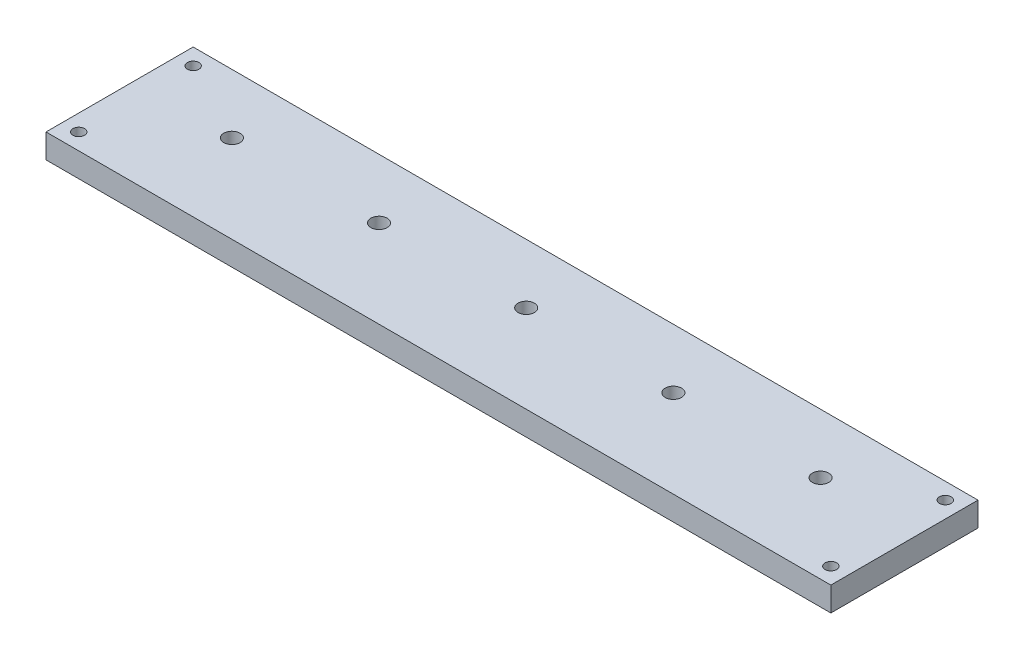
ISO-10303-21;
HEADER;
FILE_DESCRIPTION(('STEP AP214'),'2;1');
FILE_NAME('part.step','',(''),(''),'','','');
FILE_SCHEMA(('AUTOMOTIVE_DESIGN { 1 0 10303 214 1 1 1 1 }'));
ENDSEC;
DATA;
#1=APPLICATION_CONTEXT('core data for automotive mechanical design processes');
#2=APPLICATION_PROTOCOL_DEFINITION('international standard','automotive_design',2000,#1);
#3=PRODUCT_CONTEXT('',#1,'mechanical');
#4=PRODUCT('Part','Part','',(#3));
#5=PRODUCT_RELATED_PRODUCT_CATEGORY('part','',(#4));
#6=PRODUCT_DEFINITION_FORMATION('','',#4);
#7=PRODUCT_DEFINITION_CONTEXT('part definition',#1,'design');
#8=PRODUCT_DEFINITION('design','',#6,#7);
#9=PRODUCT_DEFINITION_SHAPE('','',#8);
#10=(LENGTH_UNIT() NAMED_UNIT(*) SI_UNIT(.MILLI.,.METRE.));
#11=(NAMED_UNIT(*) PLANE_ANGLE_UNIT() SI_UNIT($,.RADIAN.));
#12=(NAMED_UNIT(*) SI_UNIT($,.STERADIAN.) SOLID_ANGLE_UNIT());
#13=UNCERTAINTY_MEASURE_WITH_UNIT(LENGTH_MEASURE(1.E-05),#10,'distance_accuracy_value','');
#14=(GEOMETRIC_REPRESENTATION_CONTEXT(3) GLOBAL_UNCERTAINTY_ASSIGNED_CONTEXT((#13)) GLOBAL_UNIT_ASSIGNED_CONTEXT((#10,
#11,#12)) REPRESENTATION_CONTEXT('',''));
#15=CARTESIAN_POINT('',(0.,0.,0.));
#16=DIRECTION('',(0.,0.,1.));
#17=DIRECTION('',(1.,0.,0.));
#18=AXIS2_PLACEMENT_3D('',#15,#16,#17);
#19=CARTESIAN_POINT('',(19.05,4.699,-17.0434));
#20=DIRECTION('',(0.,-1.,0.));
#21=DIRECTION('',(0.,0.,-1.));
#22=AXIS2_PLACEMENT_3D('',#19,#20,#21);
#23=CYLINDRICAL_SURFACE('',#22,1.5875);
#24=CARTESIAN_POINT('',(19.05,4.699,-17.0434));
#25=DIRECTION('',(0.,1.,0.));
#26=DIRECTION('',(0.,0.,1.));
#27=AXIS2_PLACEMENT_3D('',#24,#25,#26);
#28=CIRCLE('',#27,1.5875);
#29=CARTESIAN_POINT('',(19.05,4.699,-15.4559));
#30=VERTEX_POINT('',#29);
#31=EDGE_CURVE('E216',#30,#30,#28,.T.);
#32=ORIENTED_EDGE('',*,*,#31,.T.);
#33=EDGE_LOOP('',(#32));
#34=FACE_BOUND('',#33,.T.);
#35=CARTESIAN_POINT('',(19.05,1.778,-17.0434));
#36=DIRECTION('',(0.,-1.,0.));
#37=DIRECTION('',(0.,0.,-1.));
#38=AXIS2_PLACEMENT_3D('',#35,#36,#37);
#39=CIRCLE('',#38,1.5875);
#40=CARTESIAN_POINT('',(19.05,1.778,-18.6309));
#41=VERTEX_POINT('',#40);
#42=EDGE_CURVE('E49',#41,#41,#39,.T.);
#43=ORIENTED_EDGE('',*,*,#42,.T.);
#44=EDGE_LOOP('',(#43));
#45=FACE_BOUND('',#44,.T.);
#46=ADVANCED_FACE('F45',(#34,#45),#23,.F.);
#47=CARTESIAN_POINT('',(47.625,4.699,-17.0434));
#48=DIRECTION('',(0.,-1.,0.));
#49=DIRECTION('',(0.,0.,-1.));
#50=AXIS2_PLACEMENT_3D('',#47,#48,#49);
#51=CYLINDRICAL_SURFACE('',#50,1.5875);
#52=CARTESIAN_POINT('',(47.625,4.699,-17.0434));
#53=DIRECTION('',(0.,1.,0.));
#54=DIRECTION('',(0.,0.,1.));
#55=AXIS2_PLACEMENT_3D('',#52,#53,#54);
#56=CIRCLE('',#55,1.5875);
#57=CARTESIAN_POINT('',(47.625,4.699,-15.4559));
#58=VERTEX_POINT('',#57);
#59=EDGE_CURVE('E213',#58,#58,#56,.T.);
#60=ORIENTED_EDGE('',*,*,#59,.T.);
#61=EDGE_LOOP('',(#60));
#62=FACE_BOUND('',#61,.T.);
#63=CARTESIAN_POINT('',(47.625,1.778,-17.0434));
#64=DIRECTION('',(0.,-1.,0.));
#65=DIRECTION('',(0.,0.,-1.));
#66=AXIS2_PLACEMENT_3D('',#63,#64,#65);
#67=CIRCLE('',#66,1.5875);
#68=CARTESIAN_POINT('',(47.625,1.778,-18.6309));
#69=VERTEX_POINT('',#68);
#70=EDGE_CURVE('E195',#69,#69,#67,.T.);
#71=ORIENTED_EDGE('',*,*,#70,.T.);
#72=EDGE_LOOP('',(#71));
#73=FACE_BOUND('',#72,.T.);
#74=ADVANCED_FACE('F254',(#62,#73),#51,.F.);
#75=CARTESIAN_POINT('',(76.2,4.699,-17.0434));
#76=DIRECTION('',(0.,-1.,0.));
#77=DIRECTION('',(0.,0.,-1.));
#78=AXIS2_PLACEMENT_3D('',#75,#76,#77);
#79=CYLINDRICAL_SURFACE('',#78,1.5875);
#80=CARTESIAN_POINT('',(76.2,4.699,-17.0434));
#81=DIRECTION('',(0.,1.,0.));
#82=DIRECTION('',(0.,0.,1.));
#83=AXIS2_PLACEMENT_3D('',#80,#81,#82);
#84=CIRCLE('',#83,1.5875);
#85=CARTESIAN_POINT('',(76.2,4.699,-15.4559));
#86=VERTEX_POINT('',#85);
#87=EDGE_CURVE('E210',#86,#86,#84,.T.);
#88=ORIENTED_EDGE('',*,*,#87,.T.);
#89=EDGE_LOOP('',(#88));
#90=FACE_BOUND('',#89,.T.);
#91=CARTESIAN_POINT('',(76.2,1.778,-17.0434));
#92=DIRECTION('',(0.,-1.,0.));
#93=DIRECTION('',(0.,0.,-1.));
#94=AXIS2_PLACEMENT_3D('',#91,#92,#93);
#95=CIRCLE('',#94,1.5875);
#96=CARTESIAN_POINT('',(76.2,1.778,-18.6309));
#97=VERTEX_POINT('',#96);
#98=EDGE_CURVE('E191',#97,#97,#95,.T.);
#99=ORIENTED_EDGE('',*,*,#98,.T.);
#100=EDGE_LOOP('',(#99));
#101=FACE_BOUND('',#100,.T.);
#102=ADVANCED_FACE('F352',(#90,#101),#79,.F.);
#103=CARTESIAN_POINT('',(104.775,4.699,-17.0434));
#104=DIRECTION('',(0.,-1.,0.));
#105=DIRECTION('',(0.,0.,-1.));
#106=AXIS2_PLACEMENT_3D('',#103,#104,#105);
#107=CYLINDRICAL_SURFACE('',#106,1.5875);
#108=CARTESIAN_POINT('',(104.775,4.699,-17.0434));
#109=DIRECTION('',(0.,1.,0.));
#110=DIRECTION('',(0.,0.,1.));
#111=AXIS2_PLACEMENT_3D('',#108,#109,#110);
#112=CIRCLE('',#111,1.5875);
#113=CARTESIAN_POINT('',(104.775,4.699,-15.4559));
#114=VERTEX_POINT('',#113);
#115=EDGE_CURVE('E206',#114,#114,#112,.T.);
#116=ORIENTED_EDGE('',*,*,#115,.T.);
#117=EDGE_LOOP('',(#116));
#118=FACE_BOUND('',#117,.T.);
#119=CARTESIAN_POINT('',(104.775,1.778,-17.0434));
#120=DIRECTION('',(0.,-1.,0.));
#121=DIRECTION('',(0.,0.,-1.));
#122=AXIS2_PLACEMENT_3D('',#119,#120,#121);
#123=CIRCLE('',#122,1.5875);
#124=CARTESIAN_POINT('',(104.775,1.778,-18.6309));
#125=VERTEX_POINT('',#124);
#126=EDGE_CURVE('E155',#125,#125,#123,.T.);
#127=ORIENTED_EDGE('',*,*,#126,.T.);
#128=EDGE_LOOP('',(#127));
#129=FACE_BOUND('',#128,.T.);
#130=ADVANCED_FACE('F361',(#118,#129),#107,.F.);
#131=CARTESIAN_POINT('',(133.35,4.699,-17.0434));
#132=DIRECTION('',(0.,-1.,0.));
#133=DIRECTION('',(0.,0.,-1.));
#134=AXIS2_PLACEMENT_3D('',#131,#132,#133);
#135=CYLINDRICAL_SURFACE('',#134,1.58749999999999);
#136=CARTESIAN_POINT('',(133.35,4.699,-17.0434));
#137=DIRECTION('',(0.,1.,0.));
#138=DIRECTION('',(0.,0.,1.));
#139=AXIS2_PLACEMENT_3D('',#136,#137,#138);
#140=CIRCLE('',#139,1.58749999999999);
#141=CARTESIAN_POINT('',(133.35,4.699,-15.4559));
#142=VERTEX_POINT('',#141);
#143=EDGE_CURVE('E203',#142,#142,#140,.T.);
#144=ORIENTED_EDGE('',*,*,#143,.T.);
#145=EDGE_LOOP('',(#144));
#146=FACE_BOUND('',#145,.T.);
#147=CARTESIAN_POINT('',(133.35,1.778,-17.0434));
#148=DIRECTION('',(0.,-1.,0.));
#149=DIRECTION('',(0.,0.,-1.));
#150=AXIS2_PLACEMENT_3D('',#147,#148,#149);
#151=CIRCLE('',#150,1.58749999999999);
#152=CARTESIAN_POINT('',(133.35,1.778,-18.6309));
#153=VERTEX_POINT('',#152);
#154=EDGE_CURVE('E156',#153,#153,#151,.T.);
#155=ORIENTED_EDGE('',*,*,#154,.T.);
#156=EDGE_LOOP('',(#155));
#157=FACE_BOUND('',#156,.T.);
#158=ADVANCED_FACE('F47',(#146,#157),#135,.F.);
#159=CARTESIAN_POINT('',(0.,4.699,0.));
#160=DIRECTION('',(0.,0.,-1.));
#161=DIRECTION('',(-1.,0.,0.));
#162=AXIS2_PLACEMENT_3D('',#159,#160,#161);
#163=PLANE('',#162);
#164=DIRECTION('',(1.,0.,0.));
#165=VECTOR('',#164,1.);
#166=CARTESIAN_POINT('',(0.,0.,0.));
#167=LINE('',#166,#165);
#168=CARTESIAN_POINT('',(0.,0.,0.));
#169=VERTEX_POINT('',#168);
#170=CARTESIAN_POINT('',(152.4,0.,0.));
#171=VERTEX_POINT('',#170);
#172=EDGE_CURVE('E202',#169,#171,#167,.T.);
#173=ORIENTED_EDGE('',*,*,#172,.T.);
#174=DIRECTION('',(0.,-1.,0.));
#175=VECTOR('',#174,1.);
#176=CARTESIAN_POINT('',(152.4,4.699,0.));
#177=LINE('',#176,#175);
#178=CARTESIAN_POINT('',(152.4,4.699,0.));
#179=VERTEX_POINT('',#178);
#180=EDGE_CURVE('E11',#179,#171,#177,.T.);
#181=ORIENTED_EDGE('',*,*,#180,.F.);
#182=DIRECTION('',(1.,0.,0.));
#183=VECTOR('',#182,1.);
#184=CARTESIAN_POINT('',(0.,4.699,0.));
#185=LINE('',#184,#183);
#186=CARTESIAN_POINT('',(0.,4.699,0.));
#187=VERTEX_POINT('',#186);
#188=EDGE_CURVE('E219',#187,#179,#185,.T.);
#189=ORIENTED_EDGE('',*,*,#188,.F.);
#190=DIRECTION('',(0.,-1.,0.));
#191=VECTOR('',#190,1.);
#192=CARTESIAN_POINT('',(0.,4.699,0.));
#193=LINE('',#192,#191);
#194=EDGE_CURVE('E230',#187,#169,#193,.T.);
#195=ORIENTED_EDGE('',*,*,#194,.T.);
#196=EDGE_LOOP('',(#173,#181,#189,#195));
#197=FACE_BOUND('',#196,.T.);
#198=ADVANCED_FACE('F357',(#197),#163,.F.);
#199=CARTESIAN_POINT('',(152.4,4.699,0.));
#200=DIRECTION('',(-1.,0.,0.));
#201=DIRECTION('',(0.,0.,1.));
#202=AXIS2_PLACEMENT_3D('',#199,#200,#201);
#203=PLANE('',#202);
#204=DIRECTION('',(0.,0.,-1.));
#205=VECTOR('',#204,1.);
#206=CARTESIAN_POINT('',(152.4,0.,0.));
#207=LINE('',#206,#205);
#208=CARTESIAN_POINT('',(152.4,0.,-28.575));
#209=VERTEX_POINT('',#208);
#210=EDGE_CURVE('E233',#171,#209,#207,.T.);
#211=ORIENTED_EDGE('',*,*,#210,.T.);
#212=DIRECTION('',(0.,-1.,0.));
#213=VECTOR('',#212,1.);
#214=CARTESIAN_POINT('',(152.4,4.699,-28.575));
#215=LINE('',#214,#213);
#216=CARTESIAN_POINT('',(152.4,4.699,-28.575));
#217=VERTEX_POINT('',#216);
#218=EDGE_CURVE('E54',#217,#209,#215,.T.);
#219=ORIENTED_EDGE('',*,*,#218,.F.);
#220=DIRECTION('',(0.,0.,-1.));
#221=VECTOR('',#220,1.);
#222=CARTESIAN_POINT('',(152.4,4.699,0.));
#223=LINE('',#222,#221);
#224=EDGE_CURVE('E222',#179,#217,#223,.T.);
#225=ORIENTED_EDGE('',*,*,#224,.F.);
#226=ORIENTED_EDGE('',*,*,#180,.T.);
#227=EDGE_LOOP('',(#211,#219,#225,#226));
#228=FACE_BOUND('',#227,.T.);
#229=ADVANCED_FACE('F321',(#228),#203,.F.);
#230=CARTESIAN_POINT('',(0.,4.699,-28.575));
#231=DIRECTION('',(0.,0.,-1.));
#232=DIRECTION('',(-1.,0.,0.));
#233=AXIS2_PLACEMENT_3D('',#230,#231,#232);
#234=PLANE('',#233);
#235=DIRECTION('',(0.,-1.,0.));
#236=VECTOR('',#235,1.);
#237=CARTESIAN_POINT('',(26.9356262554093,1.778,-28.575));
#238=LINE('',#237,#236);
#239=CARTESIAN_POINT('',(26.9356262554093,1.778,-28.575));
#240=VERTEX_POINT('',#239);
#241=CARTESIAN_POINT('',(26.9356262554093,0.,-28.575));
#242=VERTEX_POINT('',#241);
#243=EDGE_CURVE('E186',#240,#242,#238,.T.);
#244=ORIENTED_EDGE('',*,*,#243,.F.);
#245=DIRECTION('',(-1.,0.,0.));
#246=VECTOR('',#245,1.);
#247=CARTESIAN_POINT('',(0.,1.778,-28.575));
#248=LINE('',#247,#246);
#249=CARTESIAN_POINT('',(11.1643737445907,1.778,-28.575));
#250=VERTEX_POINT('',#249);
#251=EDGE_CURVE('E199',#240,#250,#248,.T.);
#252=ORIENTED_EDGE('',*,*,#251,.T.);
#253=DIRECTION('',(0.,-1.,0.));
#254=VECTOR('',#253,1.);
#255=CARTESIAN_POINT('',(11.1643737445907,1.778,-28.575));
#256=LINE('',#255,#254);
#257=CARTESIAN_POINT('',(11.1643737445907,0.,-28.575));
#258=VERTEX_POINT('',#257);
#259=EDGE_CURVE('E184',#258,#250,#256,.F.);
#260=ORIENTED_EDGE('',*,*,#259,.F.);
#261=DIRECTION('',(1.,0.,0.));
#262=VECTOR('',#261,1.);
#263=CARTESIAN_POINT('',(0.,0.,-28.575));
#264=LINE('',#263,#262);
#265=CARTESIAN_POINT('',(0.,0.,-28.575));
#266=VERTEX_POINT('',#265);
#267=EDGE_CURVE('E236',#266,#258,#264,.T.);
#268=ORIENTED_EDGE('',*,*,#267,.F.);
#269=DIRECTION('',(0.,-1.,0.));
#270=VECTOR('',#269,1.);
#271=CARTESIAN_POINT('',(0.,4.699,-28.575));
#272=LINE('',#271,#270);
#273=CARTESIAN_POINT('',(0.,4.699,-28.575));
#274=VERTEX_POINT('',#273);
#275=EDGE_CURVE('E243',#274,#266,#272,.T.);
#276=ORIENTED_EDGE('',*,*,#275,.F.);
#277=DIRECTION('',(1.,0.,0.));
#278=VECTOR('',#277,1.);
#279=CARTESIAN_POINT('',(0.,4.699,-28.575));
#280=LINE('',#279,#278);
#281=EDGE_CURVE('E224',#274,#217,#280,.T.);
#282=ORIENTED_EDGE('',*,*,#281,.T.);
#283=ORIENTED_EDGE('',*,*,#218,.T.);
#284=CARTESIAN_POINT('',(141.235626255409,0.,-28.575));
#285=VERTEX_POINT('',#284);
#286=EDGE_CURVE('E167',#285,#209,#264,.T.);
#287=ORIENTED_EDGE('',*,*,#286,.F.);
#288=DIRECTION('',(0.,-1.,0.));
#289=VECTOR('',#288,1.);
#290=CARTESIAN_POINT('',(141.235626255409,1.778,-28.575));
#291=LINE('',#290,#289);
#292=CARTESIAN_POINT('',(141.235626255409,1.778,-28.575));
#293=VERTEX_POINT('',#292);
#294=EDGE_CURVE('E62',#293,#285,#291,.T.);
#295=ORIENTED_EDGE('',*,*,#294,.F.);
#296=DIRECTION('',(-1.,0.,0.));
#297=VECTOR('',#296,1.);
#298=CARTESIAN_POINT('',(0.,1.778,-28.575));
#299=LINE('',#298,#297);
#300=CARTESIAN_POINT('',(125.464373744591,1.778,-28.575));
#301=VERTEX_POINT('',#300);
#302=EDGE_CURVE('E150',#293,#301,#299,.T.);
#303=ORIENTED_EDGE('',*,*,#302,.T.);
#304=DIRECTION('',(0.,-1.,0.));
#305=VECTOR('',#304,1.);
#306=CARTESIAN_POINT('',(125.464373744591,1.778,-28.575));
#307=LINE('',#306,#305);
#308=CARTESIAN_POINT('',(125.464373744591,0.,-28.575));
#309=VERTEX_POINT('',#308);
#310=EDGE_CURVE('E159',#309,#301,#307,.F.);
#311=ORIENTED_EDGE('',*,*,#310,.F.);
#312=CARTESIAN_POINT('',(112.660626255409,0.,-28.575));
#313=VERTEX_POINT('',#312);
#314=EDGE_CURVE('E323',#313,#309,#264,.T.);
#315=ORIENTED_EDGE('',*,*,#314,.F.);
#316=DIRECTION('',(0.,-1.,0.));
#317=VECTOR('',#316,1.);
#318=CARTESIAN_POINT('',(112.660626255409,1.778,-28.575));
#319=LINE('',#318,#317);
#320=CARTESIAN_POINT('',(112.660626255409,1.778,-28.575));
#321=VERTEX_POINT('',#320);
#322=EDGE_CURVE('E70',#321,#313,#319,.T.);
#323=ORIENTED_EDGE('',*,*,#322,.F.);
#324=DIRECTION('',(-1.,0.,0.));
#325=VECTOR('',#324,1.);
#326=CARTESIAN_POINT('',(0.,1.778,-28.575));
#327=LINE('',#326,#325);
#328=CARTESIAN_POINT('',(96.8893737445907,1.778,-28.575));
#329=VERTEX_POINT('',#328);
#330=EDGE_CURVE('E188',#321,#329,#327,.T.);
#331=ORIENTED_EDGE('',*,*,#330,.T.);
#332=DIRECTION('',(0.,-1.,0.));
#333=VECTOR('',#332,1.);
#334=CARTESIAN_POINT('',(96.8893737445907,1.778,-28.575));
#335=LINE('',#334,#333);
#336=CARTESIAN_POINT('',(96.8893737445907,0.,-28.575));
#337=VERTEX_POINT('',#336);
#338=EDGE_CURVE('E168',#337,#329,#335,.F.);
#339=ORIENTED_EDGE('',*,*,#338,.F.);
#340=CARTESIAN_POINT('',(84.0856262554093,0.,-28.575));
#341=VERTEX_POINT('',#340);
#342=EDGE_CURVE('E324',#341,#337,#264,.T.);
#343=ORIENTED_EDGE('',*,*,#342,.F.);
#344=DIRECTION('',(0.,-1.,0.));
#345=VECTOR('',#344,1.);
#346=CARTESIAN_POINT('',(84.0856262554093,1.778,-28.575));
#347=LINE('',#346,#345);
#348=CARTESIAN_POINT('',(84.0856262554093,1.778,-28.575));
#349=VERTEX_POINT('',#348);
#350=EDGE_CURVE('E178',#349,#341,#347,.T.);
#351=ORIENTED_EDGE('',*,*,#350,.F.);
#352=DIRECTION('',(-1.,0.,0.));
#353=VECTOR('',#352,1.);
#354=CARTESIAN_POINT('',(0.,1.778,-28.575));
#355=LINE('',#354,#353);
#356=CARTESIAN_POINT('',(68.3143737445907,1.778,-28.575));
#357=VERTEX_POINT('',#356);
#358=EDGE_CURVE('E192',#349,#357,#355,.T.);
#359=ORIENTED_EDGE('',*,*,#358,.T.);
#360=DIRECTION('',(0.,-1.,0.));
#361=VECTOR('',#360,1.);
#362=CARTESIAN_POINT('',(68.3143737445907,1.778,-28.575));
#363=LINE('',#362,#361);
#364=CARTESIAN_POINT('',(68.3143737445907,0.,-28.575));
#365=VERTEX_POINT('',#364);
#366=EDGE_CURVE('E176',#365,#357,#363,.F.);
#367=ORIENTED_EDGE('',*,*,#366,.F.);
#368=CARTESIAN_POINT('',(55.5106262554093,0.,-28.575));
#369=VERTEX_POINT('',#368);
#370=EDGE_CURVE('E276',#369,#365,#264,.T.);
#371=ORIENTED_EDGE('',*,*,#370,.F.);
#372=DIRECTION('',(0.,-1.,0.));
#373=VECTOR('',#372,1.);
#374=CARTESIAN_POINT('',(55.5106262554093,1.778,-28.575));
#375=LINE('',#374,#373);
#376=CARTESIAN_POINT('',(55.5106262554093,1.778,-28.575));
#377=VERTEX_POINT('',#376);
#378=EDGE_CURVE('E182',#377,#369,#375,.T.);
#379=ORIENTED_EDGE('',*,*,#378,.F.);
#380=DIRECTION('',(-1.,0.,0.));
#381=VECTOR('',#380,1.);
#382=CARTESIAN_POINT('',(0.,1.778,-28.575));
#383=LINE('',#382,#381);
#384=CARTESIAN_POINT('',(39.7393737445907,1.778,-28.575));
#385=VERTEX_POINT('',#384);
#386=EDGE_CURVE('E196',#377,#385,#383,.T.);
#387=ORIENTED_EDGE('',*,*,#386,.T.);
#388=DIRECTION('',(0.,-1.,0.));
#389=VECTOR('',#388,1.);
#390=CARTESIAN_POINT('',(39.7393737445907,1.778,-28.575));
#391=LINE('',#390,#389);
#392=CARTESIAN_POINT('',(39.7393737445907,0.,-28.575));
#393=VERTEX_POINT('',#392);
#394=EDGE_CURVE('E180',#393,#385,#391,.F.);
#395=ORIENTED_EDGE('',*,*,#394,.F.);
#396=EDGE_CURVE('E239',#242,#393,#264,.T.);
#397=ORIENTED_EDGE('',*,*,#396,.F.);
#398=EDGE_LOOP('',(#244,#252,#260,#268,#276,#282,#283,#287,#295,#303,#311,#315,#323,#331,#339,
#343,#351,#359,#367,#371,#379,#387,#395,#397));
#399=FACE_BOUND('',#398,.T.);
#400=ADVANCED_FACE('F165',(#399),#234,.T.);
#401=CARTESIAN_POINT('',(0.,4.699,0.));
#402=DIRECTION('',(-1.,0.,0.));
#403=DIRECTION('',(0.,0.,1.));
#404=AXIS2_PLACEMENT_3D('',#401,#402,#403);
#405=PLANE('',#404);
#406=DIRECTION('',(0.,0.,-1.));
#407=VECTOR('',#406,1.);
#408=CARTESIAN_POINT('',(0.,0.,0.));
#409=LINE('',#408,#407);
#410=EDGE_CURVE('E207',#169,#266,#409,.T.);
#411=ORIENTED_EDGE('',*,*,#410,.F.);
#412=ORIENTED_EDGE('',*,*,#194,.F.);
#413=DIRECTION('',(0.,0.,-1.));
#414=VECTOR('',#413,1.);
#415=CARTESIAN_POINT('',(0.,4.699,0.));
#416=LINE('',#415,#414);
#417=EDGE_CURVE('E227',#187,#274,#416,.T.);
#418=ORIENTED_EDGE('',*,*,#417,.T.);
#419=ORIENTED_EDGE('',*,*,#275,.T.);
#420=EDGE_LOOP('',(#411,#412,#418,#419));
#421=FACE_BOUND('',#420,.T.);
#422=ADVANCED_FACE('F312',(#421),#405,.T.);
#423=CARTESIAN_POINT('',(0.,4.699,0.));
#424=DIRECTION('',(0.,1.,0.));
#425=DIRECTION('',(0.,0.,1.));
#426=AXIS2_PLACEMENT_3D('',#423,#424,#425);
#427=PLANE('',#426);
#428=CARTESIAN_POINT('',(3.175,4.699,-25.4));
#429=DIRECTION('',(0.,1.,0.));
#430=DIRECTION('',(0.,0.,1.));
#431=AXIS2_PLACEMENT_3D('',#428,#429,#430);
#432=CIRCLE('',#431,1.1303);
#433=CARTESIAN_POINT('',(3.175,4.699,-24.2697));
#434=VERTEX_POINT('',#433);
#435=EDGE_CURVE('E422',#434,#434,#432,.T.);
#436=ORIENTED_EDGE('',*,*,#435,.F.);
#437=EDGE_LOOP('',(#436));
#438=FACE_BOUND('',#437,.T.);
#439=CARTESIAN_POINT('',(3.175,4.699,-3.175));
#440=DIRECTION('',(0.,1.,0.));
#441=DIRECTION('',(0.,0.,1.));
#442=AXIS2_PLACEMENT_3D('',#439,#440,#441);
#443=CIRCLE('',#442,1.1303);
#444=CARTESIAN_POINT('',(3.175,4.699,-2.0447));
#445=VERTEX_POINT('',#444);
#446=EDGE_CURVE('E424',#445,#445,#443,.T.);
#447=ORIENTED_EDGE('',*,*,#446,.F.);
#448=EDGE_LOOP('',(#447));
#449=FACE_BOUND('',#448,.T.);
#450=CARTESIAN_POINT('',(149.225,4.699,-3.175));
#451=DIRECTION('',(0.,1.,0.));
#452=DIRECTION('',(0.,0.,1.));
#453=AXIS2_PLACEMENT_3D('',#450,#451,#452);
#454=CIRCLE('',#453,1.1303);
#455=CARTESIAN_POINT('',(149.225,4.699,-2.0447));
#456=VERTEX_POINT('',#455);
#457=EDGE_CURVE('E432',#456,#456,#454,.T.);
#458=ORIENTED_EDGE('',*,*,#457,.F.);
#459=EDGE_LOOP('',(#458));
#460=FACE_BOUND('',#459,.T.);
#461=CARTESIAN_POINT('',(149.225,4.699,-25.4));
#462=DIRECTION('',(0.,1.,0.));
#463=DIRECTION('',(0.,0.,1.));
#464=AXIS2_PLACEMENT_3D('',#461,#462,#463);
#465=CIRCLE('',#464,1.1303);
#466=CARTESIAN_POINT('',(149.225,4.699,-24.2697));
#467=VERTEX_POINT('',#466);
#468=EDGE_CURVE('E295',#467,#467,#465,.T.);
#469=ORIENTED_EDGE('',*,*,#468,.F.);
#470=EDGE_LOOP('',(#469));
#471=FACE_BOUND('',#470,.T.);
#472=ORIENTED_EDGE('',*,*,#143,.F.);
#473=EDGE_LOOP('',(#472));
#474=FACE_BOUND('',#473,.T.);
#475=ORIENTED_EDGE('',*,*,#115,.F.);
#476=EDGE_LOOP('',(#475));
#477=FACE_BOUND('',#476,.T.);
#478=ORIENTED_EDGE('',*,*,#87,.F.);
#479=EDGE_LOOP('',(#478));
#480=FACE_BOUND('',#479,.T.);
#481=ORIENTED_EDGE('',*,*,#59,.F.);
#482=EDGE_LOOP('',(#481));
#483=FACE_BOUND('',#482,.T.);
#484=ORIENTED_EDGE('',*,*,#31,.F.);
#485=EDGE_LOOP('',(#484));
#486=FACE_BOUND('',#485,.T.);
#487=ORIENTED_EDGE('',*,*,#188,.T.);
#488=ORIENTED_EDGE('',*,*,#224,.T.);
#489=ORIENTED_EDGE('',*,*,#281,.F.);
#490=ORIENTED_EDGE('',*,*,#417,.F.);
#491=EDGE_LOOP('',(#487,#488,#489,#490));
#492=FACE_BOUND('',#491,.T.);
#493=ADVANCED_FACE('F317',(#438,#449,#460,#471,#474,#477,#480,#483,#486,#492),#427,.T.);
#494=CARTESIAN_POINT('',(0.,0.,0.));
#495=DIRECTION('',(0.,1.,0.));
#496=DIRECTION('',(0.,0.,1.));
#497=AXIS2_PLACEMENT_3D('',#494,#495,#496);
#498=PLANE('',#497);
#499=CARTESIAN_POINT('',(3.175,0.,-25.4));
#500=DIRECTION('',(0.,1.,0.));
#501=DIRECTION('',(0.,0.,1.));
#502=AXIS2_PLACEMENT_3D('',#499,#500,#501);
#503=CIRCLE('',#502,1.1303);
#504=CARTESIAN_POINT('',(3.175,0.,-24.2697));
#505=VERTEX_POINT('',#504);
#506=EDGE_CURVE('E419',#505,#505,#503,.T.);
#507=ORIENTED_EDGE('',*,*,#506,.T.);
#508=EDGE_LOOP('',(#507));
#509=FACE_BOUND('',#508,.T.);
#510=CARTESIAN_POINT('',(3.175,0.,-3.175));
#511=DIRECTION('',(0.,1.,0.));
#512=DIRECTION('',(0.,0.,1.));
#513=AXIS2_PLACEMENT_3D('',#510,#511,#512);
#514=CIRCLE('',#513,1.1303);
#515=CARTESIAN_POINT('',(3.175,0.,-2.0447));
#516=VERTEX_POINT('',#515);
#517=EDGE_CURVE('E429',#516,#516,#514,.T.);
#518=ORIENTED_EDGE('',*,*,#517,.T.);
#519=EDGE_LOOP('',(#518));
#520=FACE_BOUND('',#519,.T.);
#521=CARTESIAN_POINT('',(149.225,0.,-3.175));
#522=DIRECTION('',(0.,1.,0.));
#523=DIRECTION('',(0.,0.,1.));
#524=AXIS2_PLACEMENT_3D('',#521,#522,#523);
#525=CIRCLE('',#524,1.1303);
#526=CARTESIAN_POINT('',(149.225,0.,-2.0447));
#527=VERTEX_POINT('',#526);
#528=EDGE_CURVE('E300',#527,#527,#525,.T.);
#529=ORIENTED_EDGE('',*,*,#528,.T.);
#530=EDGE_LOOP('',(#529));
#531=FACE_BOUND('',#530,.T.);
#532=CARTESIAN_POINT('',(149.225,0.,-25.4));
#533=DIRECTION('',(0.,1.,0.));
#534=DIRECTION('',(0.,0.,1.));
#535=AXIS2_PLACEMENT_3D('',#532,#533,#534);
#536=CIRCLE('',#535,1.1303);
#537=CARTESIAN_POINT('',(149.225,0.,-24.2697));
#538=VERTEX_POINT('',#537);
#539=EDGE_CURVE('E293',#538,#538,#536,.T.);
#540=ORIENTED_EDGE('',*,*,#539,.T.);
#541=EDGE_LOOP('',(#540));
#542=FACE_BOUND('',#541,.T.);
#543=ORIENTED_EDGE('',*,*,#267,.T.);
#544=CARTESIAN_POINT('',(19.05,0.,-17.0434));
#545=DIRECTION('',(0.,-1.,0.));
#546=DIRECTION('',(0.,0.,-1.));
#547=AXIS2_PLACEMENT_3D('',#544,#545,#546);
#548=CIRCLE('',#547,13.97);
#549=EDGE_CURVE('E267',#242,#258,#548,.T.);
#550=ORIENTED_EDGE('',*,*,#549,.F.);
#551=ORIENTED_EDGE('',*,*,#396,.T.);
#552=CARTESIAN_POINT('',(47.625,0.,-17.0434));
#553=DIRECTION('',(0.,-1.,0.));
#554=DIRECTION('',(0.,0.,-1.));
#555=AXIS2_PLACEMENT_3D('',#552,#553,#554);
#556=CIRCLE('',#555,13.97);
#557=EDGE_CURVE('E268',#369,#393,#556,.T.);
#558=ORIENTED_EDGE('',*,*,#557,.F.);
#559=ORIENTED_EDGE('',*,*,#370,.T.);
#560=CARTESIAN_POINT('',(76.2,0.,-17.0434));
#561=DIRECTION('',(0.,-1.,0.));
#562=DIRECTION('',(0.,0.,-1.));
#563=AXIS2_PLACEMENT_3D('',#560,#561,#562);
#564=CIRCLE('',#563,13.97);
#565=EDGE_CURVE('E285',#341,#365,#564,.T.);
#566=ORIENTED_EDGE('',*,*,#565,.F.);
#567=ORIENTED_EDGE('',*,*,#342,.T.);
#568=CARTESIAN_POINT('',(104.775,0.,-17.0434));
#569=DIRECTION('',(0.,-1.,0.));
#570=DIRECTION('',(0.,0.,-1.));
#571=AXIS2_PLACEMENT_3D('',#568,#569,#570);
#572=CIRCLE('',#571,13.97);
#573=EDGE_CURVE('E160',#313,#337,#572,.T.);
#574=ORIENTED_EDGE('',*,*,#573,.F.);
#575=ORIENTED_EDGE('',*,*,#314,.T.);
#576=CARTESIAN_POINT('',(133.35,0.,-17.0434));
#577=DIRECTION('',(0.,-1.,0.));
#578=DIRECTION('',(0.,0.,-1.));
#579=AXIS2_PLACEMENT_3D('',#576,#577,#578);
#580=CIRCLE('',#579,13.97);
#581=EDGE_CURVE('E161',#285,#309,#580,.T.);
#582=ORIENTED_EDGE('',*,*,#581,.F.);
#583=ORIENTED_EDGE('',*,*,#286,.T.);
#584=ORIENTED_EDGE('',*,*,#210,.F.);
#585=ORIENTED_EDGE('',*,*,#172,.F.);
#586=ORIENTED_EDGE('',*,*,#410,.T.);
#587=EDGE_LOOP('',(#543,#550,#551,#558,#559,#566,#567,#574,#575,#582,#583,#584,#585,#586));
#588=FACE_BOUND('',#587,.T.);
#589=ADVANCED_FACE('F279',(#509,#520,#531,#542,#588),#498,.F.);
#590=CARTESIAN_POINT('',(133.35,1.778,-17.0434));
#591=DIRECTION('',(0.,-1.,0.));
#592=DIRECTION('',(0.,0.,-1.));
#593=AXIS2_PLACEMENT_3D('',#590,#591,#592);
#594=CYLINDRICAL_SURFACE('',#593,13.97);
#595=ORIENTED_EDGE('',*,*,#294,.T.);
#596=ORIENTED_EDGE('',*,*,#581,.T.);
#597=ORIENTED_EDGE('',*,*,#310,.T.);
#598=CARTESIAN_POINT('',(133.35,1.778,-17.0434));
#599=DIRECTION('',(0.,-1.,0.));
#600=DIRECTION('',(0.,0.,-1.));
#601=AXIS2_PLACEMENT_3D('',#598,#599,#600);
#602=CIRCLE('',#601,13.97);
#603=EDGE_CURVE('E152',#293,#301,#602,.T.);
#604=ORIENTED_EDGE('',*,*,#603,.F.);
#605=EDGE_LOOP('',(#595,#596,#597,#604));
#606=FACE_BOUND('',#605,.T.);
#607=ADVANCED_FACE('F158',(#606),#594,.F.);
#608=CARTESIAN_POINT('',(133.35,1.778,-17.0434));
#609=DIRECTION('',(0.,-1.,0.));
#610=DIRECTION('',(0.,0.,-1.));
#611=AXIS2_PLACEMENT_3D('',#608,#609,#610);
#612=PLANE('',#611);
#613=ORIENTED_EDGE('',*,*,#154,.F.);
#614=EDGE_LOOP('',(#613));
#615=FACE_BOUND('',#614,.T.);
#616=ORIENTED_EDGE('',*,*,#603,.T.);
#617=ORIENTED_EDGE('',*,*,#302,.F.);
#618=EDGE_LOOP('',(#616,#617));
#619=FACE_BOUND('',#618,.T.);
#620=ADVANCED_FACE('F151',(#615,#619),#612,.T.);
#621=CARTESIAN_POINT('',(104.775,1.778,-17.0434));
#622=DIRECTION('',(0.,-1.,0.));
#623=DIRECTION('',(0.,0.,-1.));
#624=AXIS2_PLACEMENT_3D('',#621,#622,#623);
#625=CYLINDRICAL_SURFACE('',#624,13.97);
#626=ORIENTED_EDGE('',*,*,#322,.T.);
#627=ORIENTED_EDGE('',*,*,#573,.T.);
#628=ORIENTED_EDGE('',*,*,#338,.T.);
#629=CARTESIAN_POINT('',(104.775,1.778,-17.0434));
#630=DIRECTION('',(0.,-1.,0.));
#631=DIRECTION('',(0.,0.,-1.));
#632=AXIS2_PLACEMENT_3D('',#629,#630,#631);
#633=CIRCLE('',#632,13.97);
#634=EDGE_CURVE('E290',#321,#329,#633,.T.);
#635=ORIENTED_EDGE('',*,*,#634,.F.);
#636=EDGE_LOOP('',(#626,#627,#628,#635));
#637=FACE_BOUND('',#636,.T.);
#638=ADVANCED_FACE('F330',(#637),#625,.F.);
#639=CARTESIAN_POINT('',(104.775,1.778,-17.0434));
#640=DIRECTION('',(0.,-1.,0.));
#641=DIRECTION('',(0.,0.,-1.));
#642=AXIS2_PLACEMENT_3D('',#639,#640,#641);
#643=PLANE('',#642);
#644=ORIENTED_EDGE('',*,*,#126,.F.);
#645=EDGE_LOOP('',(#644));
#646=FACE_BOUND('',#645,.T.);
#647=ORIENTED_EDGE('',*,*,#634,.T.);
#648=ORIENTED_EDGE('',*,*,#330,.F.);
#649=EDGE_LOOP('',(#647,#648));
#650=FACE_BOUND('',#649,.T.);
#651=ADVANCED_FACE('F332',(#646,#650),#643,.T.);
#652=CARTESIAN_POINT('',(76.2,1.778,-17.0434));
#653=DIRECTION('',(0.,-1.,0.));
#654=DIRECTION('',(0.,0.,-1.));
#655=AXIS2_PLACEMENT_3D('',#652,#653,#654);
#656=CYLINDRICAL_SURFACE('',#655,13.97);
#657=ORIENTED_EDGE('',*,*,#350,.T.);
#658=ORIENTED_EDGE('',*,*,#565,.T.);
#659=ORIENTED_EDGE('',*,*,#366,.T.);
#660=CARTESIAN_POINT('',(76.2,1.778,-17.0434));
#661=DIRECTION('',(0.,-1.,0.));
#662=DIRECTION('',(0.,0.,-1.));
#663=AXIS2_PLACEMENT_3D('',#660,#661,#662);
#664=CIRCLE('',#663,13.97);
#665=EDGE_CURVE('E282',#349,#357,#664,.T.);
#666=ORIENTED_EDGE('',*,*,#665,.F.);
#667=EDGE_LOOP('',(#657,#658,#659,#666));
#668=FACE_BOUND('',#667,.T.);
#669=ADVANCED_FACE('F334',(#668),#656,.F.);
#670=CARTESIAN_POINT('',(76.2,1.778,-17.0434));
#671=DIRECTION('',(0.,-1.,0.));
#672=DIRECTION('',(0.,0.,-1.));
#673=AXIS2_PLACEMENT_3D('',#670,#671,#672);
#674=PLANE('',#673);
#675=ORIENTED_EDGE('',*,*,#98,.F.);
#676=EDGE_LOOP('',(#675));
#677=FACE_BOUND('',#676,.T.);
#678=ORIENTED_EDGE('',*,*,#665,.T.);
#679=ORIENTED_EDGE('',*,*,#358,.F.);
#680=EDGE_LOOP('',(#678,#679));
#681=FACE_BOUND('',#680,.T.);
#682=ADVANCED_FACE('F341',(#677,#681),#674,.T.);
#683=CARTESIAN_POINT('',(47.625,1.778,-17.0434));
#684=DIRECTION('',(0.,-1.,0.));
#685=DIRECTION('',(0.,0.,-1.));
#686=AXIS2_PLACEMENT_3D('',#683,#684,#685);
#687=CYLINDRICAL_SURFACE('',#686,13.97);
#688=ORIENTED_EDGE('',*,*,#378,.T.);
#689=ORIENTED_EDGE('',*,*,#557,.T.);
#690=ORIENTED_EDGE('',*,*,#394,.T.);
#691=CARTESIAN_POINT('',(47.625,1.778,-17.0434));
#692=DIRECTION('',(0.,-1.,0.));
#693=DIRECTION('',(0.,0.,-1.));
#694=AXIS2_PLACEMENT_3D('',#691,#692,#693);
#695=CIRCLE('',#694,13.97);
#696=EDGE_CURVE('E264',#377,#385,#695,.T.);
#697=ORIENTED_EDGE('',*,*,#696,.F.);
#698=EDGE_LOOP('',(#688,#689,#690,#697));
#699=FACE_BOUND('',#698,.T.);
#700=ADVANCED_FACE('F260',(#699),#687,.F.);
#701=CARTESIAN_POINT('',(47.625,1.778,-17.0434));
#702=DIRECTION('',(0.,-1.,0.));
#703=DIRECTION('',(0.,0.,-1.));
#704=AXIS2_PLACEMENT_3D('',#701,#702,#703);
#705=PLANE('',#704);
#706=ORIENTED_EDGE('',*,*,#70,.F.);
#707=EDGE_LOOP('',(#706));
#708=FACE_BOUND('',#707,.T.);
#709=ORIENTED_EDGE('',*,*,#696,.T.);
#710=ORIENTED_EDGE('',*,*,#386,.F.);
#711=EDGE_LOOP('',(#709,#710));
#712=FACE_BOUND('',#711,.T.);
#713=ADVANCED_FACE('F256',(#708,#712),#705,.T.);
#714=CARTESIAN_POINT('',(19.05,1.778,-17.0434));
#715=DIRECTION('',(0.,-1.,0.));
#716=DIRECTION('',(0.,0.,-1.));
#717=AXIS2_PLACEMENT_3D('',#714,#715,#716);
#718=CYLINDRICAL_SURFACE('',#717,13.97);
#719=ORIENTED_EDGE('',*,*,#243,.T.);
#720=ORIENTED_EDGE('',*,*,#549,.T.);
#721=ORIENTED_EDGE('',*,*,#259,.T.);
#722=CARTESIAN_POINT('',(19.05,1.778,-17.0434));
#723=DIRECTION('',(0.,-1.,0.));
#724=DIRECTION('',(0.,0.,-1.));
#725=AXIS2_PLACEMENT_3D('',#722,#723,#724);
#726=CIRCLE('',#725,13.97);
#727=EDGE_CURVE('E171',#240,#250,#726,.T.);
#728=ORIENTED_EDGE('',*,*,#727,.F.);
#729=EDGE_LOOP('',(#719,#720,#721,#728));
#730=FACE_BOUND('',#729,.T.);
#731=ADVANCED_FACE('F259',(#730),#718,.F.);
#732=CARTESIAN_POINT('',(19.05,1.778,-17.0434));
#733=DIRECTION('',(0.,-1.,0.));
#734=DIRECTION('',(0.,0.,-1.));
#735=AXIS2_PLACEMENT_3D('',#732,#733,#734);
#736=PLANE('',#735);
#737=ORIENTED_EDGE('',*,*,#42,.F.);
#738=EDGE_LOOP('',(#737));
#739=FACE_BOUND('',#738,.T.);
#740=ORIENTED_EDGE('',*,*,#727,.T.);
#741=ORIENTED_EDGE('',*,*,#251,.F.);
#742=EDGE_LOOP('',(#740,#741));
#743=FACE_BOUND('',#742,.T.);
#744=ADVANCED_FACE('F395',(#739,#743),#736,.T.);
#745=CARTESIAN_POINT('',(149.225,4.699,-25.4));
#746=DIRECTION('',(0.,1.,0.));
#747=DIRECTION('',(0.,0.,1.));
#748=AXIS2_PLACEMENT_3D('',#745,#746,#747);
#749=CYLINDRICAL_SURFACE('',#748,1.1303);
#750=ORIENTED_EDGE('',*,*,#539,.F.);
#751=EDGE_LOOP('',(#750));
#752=FACE_BOUND('',#751,.T.);
#753=ORIENTED_EDGE('',*,*,#468,.T.);
#754=EDGE_LOOP('',(#753));
#755=FACE_BOUND('',#754,.T.);
#756=ADVANCED_FACE('F398',(#752,#755),#749,.F.);
#757=CARTESIAN_POINT('',(149.225,4.699,-3.175));
#758=DIRECTION('',(0.,1.,0.));
#759=DIRECTION('',(0.,0.,1.));
#760=AXIS2_PLACEMENT_3D('',#757,#758,#759);
#761=CYLINDRICAL_SURFACE('',#760,1.1303);
#762=ORIENTED_EDGE('',*,*,#528,.F.);
#763=EDGE_LOOP('',(#762));
#764=FACE_BOUND('',#763,.T.);
#765=ORIENTED_EDGE('',*,*,#457,.T.);
#766=EDGE_LOOP('',(#765));
#767=FACE_BOUND('',#766,.T.);
#768=ADVANCED_FACE('F402',(#764,#767),#761,.F.);
#769=CARTESIAN_POINT('',(3.175,4.699,-3.175));
#770=DIRECTION('',(0.,1.,0.));
#771=DIRECTION('',(0.,0.,1.));
#772=AXIS2_PLACEMENT_3D('',#769,#770,#771);
#773=CYLINDRICAL_SURFACE('',#772,1.1303);
#774=ORIENTED_EDGE('',*,*,#517,.F.);
#775=EDGE_LOOP('',(#774));
#776=FACE_BOUND('',#775,.T.);
#777=ORIENTED_EDGE('',*,*,#446,.T.);
#778=EDGE_LOOP('',(#777));
#779=FACE_BOUND('',#778,.T.);
#780=ADVANCED_FACE('F406',(#776,#779),#773,.F.);
#781=CARTESIAN_POINT('',(3.175,4.699,-25.4));
#782=DIRECTION('',(0.,1.,0.));
#783=DIRECTION('',(0.,0.,1.));
#784=AXIS2_PLACEMENT_3D('',#781,#782,#783);
#785=CYLINDRICAL_SURFACE('',#784,1.1303);
#786=ORIENTED_EDGE('',*,*,#506,.F.);
#787=EDGE_LOOP('',(#786));
#788=FACE_BOUND('',#787,.T.);
#789=ORIENTED_EDGE('',*,*,#435,.T.);
#790=EDGE_LOOP('',(#789));
#791=FACE_BOUND('',#790,.T.);
#792=ADVANCED_FACE('F410',(#788,#791),#785,.F.);
#793=CLOSED_SHELL('',(#46,#74,#102,#130,#158,#198,#229,#400,#422,#493,#589,#607,#620,#638,#651,
#669,#682,#700,#713,#731,#744,#756,#768,#780,#792));
#794=MANIFOLD_SOLID_BREP('B2',#793);
#795=ADVANCED_BREP_SHAPE_REPRESENTATION('',(#18,#794),#14);
#796=SHAPE_DEFINITION_REPRESENTATION(#9,#795);
ENDSEC;
END-ISO-10303-21;
